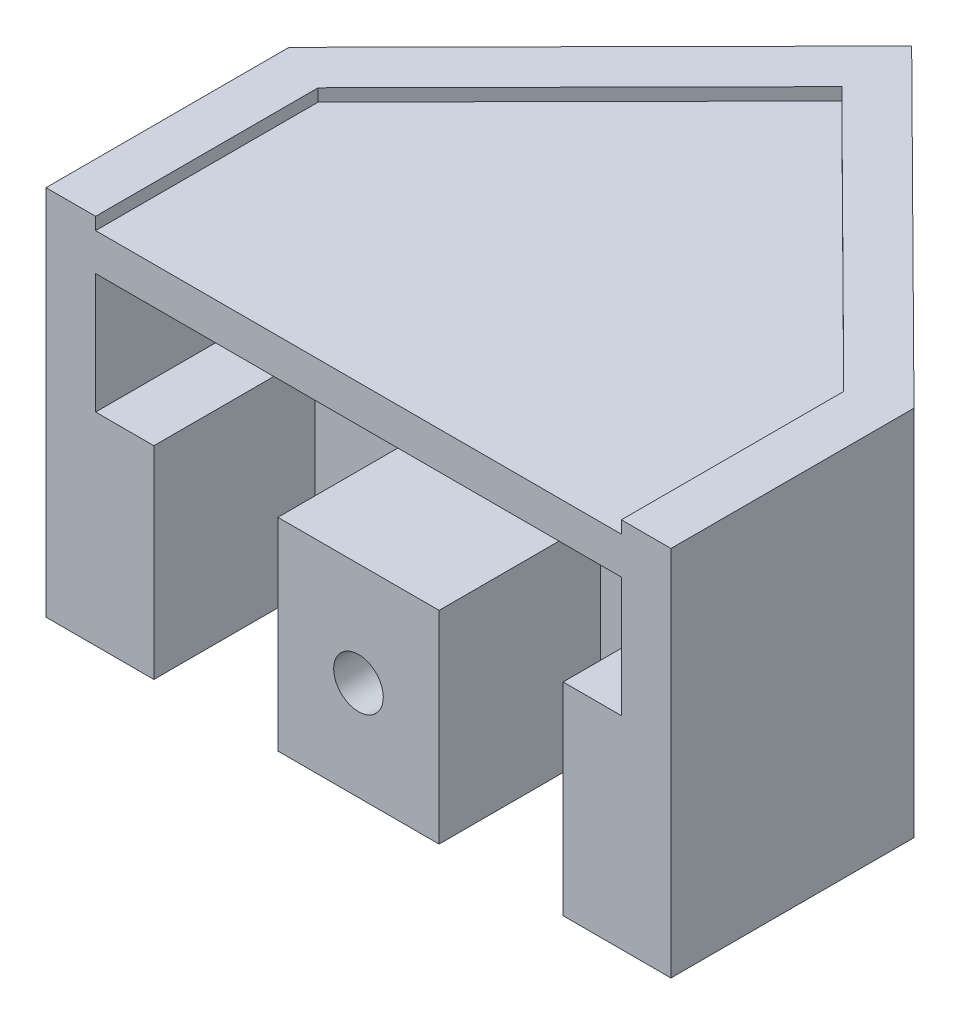
ISO-10303-21;
HEADER;
FILE_DESCRIPTION(('STEP AP214'),'2;1');
FILE_NAME('part.step','',(''),(''),'','','');
FILE_SCHEMA(('AUTOMOTIVE_DESIGN { 1 0 10303 214 1 1 1 1 }'));
ENDSEC;
DATA;
#1=APPLICATION_CONTEXT('core data for automotive mechanical design processes');
#2=APPLICATION_PROTOCOL_DEFINITION('international standard','automotive_design',2000,#1);
#3=PRODUCT_CONTEXT('',#1,'mechanical');
#4=PRODUCT('Part','Part','',(#3));
#5=PRODUCT_RELATED_PRODUCT_CATEGORY('part','',(#4));
#6=PRODUCT_DEFINITION_FORMATION('','',#4);
#7=PRODUCT_DEFINITION_CONTEXT('part definition',#1,'design');
#8=PRODUCT_DEFINITION('design','',#6,#7);
#9=PRODUCT_DEFINITION_SHAPE('','',#8);
#10=(LENGTH_UNIT() NAMED_UNIT(*) SI_UNIT(.MILLI.,.METRE.));
#11=(NAMED_UNIT(*) PLANE_ANGLE_UNIT() SI_UNIT($,.RADIAN.));
#12=(NAMED_UNIT(*) SI_UNIT($,.STERADIAN.) SOLID_ANGLE_UNIT());
#13=UNCERTAINTY_MEASURE_WITH_UNIT(LENGTH_MEASURE(1.E-05),#10,'distance_accuracy_value','');
#14=(GEOMETRIC_REPRESENTATION_CONTEXT(3) GLOBAL_UNCERTAINTY_ASSIGNED_CONTEXT((#13)) GLOBAL_UNIT_ASSIGNED_CONTEXT((#10,
#11,#12)) REPRESENTATION_CONTEXT('',''));
#15=CARTESIAN_POINT('',(0.,0.,0.));
#16=DIRECTION('',(0.,0.,1.));
#17=DIRECTION('',(1.,0.,0.));
#18=AXIS2_PLACEMENT_3D('',#15,#16,#17);
#19=CARTESIAN_POINT('',(0.,0.,2.));
#20=DIRECTION('',(0.,0.,1.));
#21=DIRECTION('',(1.,0.,0.));
#22=AXIS2_PLACEMENT_3D('',#19,#20,#21);
#23=PLANE('',#22);
#24=DIRECTION('',(1.,0.,0.));
#25=VECTOR('',#24,1.);
#26=CARTESIAN_POINT('',(0.,8.16308350215299,2.));
#27=LINE('',#26,#25);
#28=CARTESIAN_POINT('',(-23.2,8.16308350215299,2.));
#29=VERTEX_POINT('',#28);
#30=CARTESIAN_POINT('',(-2.,8.16308350215299,2.));
#31=VERTEX_POINT('',#30);
#32=EDGE_CURVE('E279',#29,#31,#27,.T.);
#33=ORIENTED_EDGE('',*,*,#32,.T.);
#34=DIRECTION('',(0.,1.,0.));
#35=VECTOR('',#34,1.);
#36=CARTESIAN_POINT('',(-2.,0.,2.));
#37=LINE('',#36,#35);
#38=CARTESIAN_POINT('',(-2.,13.,2.));
#39=VERTEX_POINT('',#38);
#40=EDGE_CURVE('E319',#31,#39,#37,.T.);
#41=ORIENTED_EDGE('',*,*,#40,.T.);
#42=DIRECTION('',(1.,0.,0.));
#43=VECTOR('',#42,1.);
#44=CARTESIAN_POINT('',(0.,13.,2.));
#45=LINE('',#44,#43);
#46=CARTESIAN_POINT('',(-23.2,13.,2.));
#47=VERTEX_POINT('',#46);
#48=EDGE_CURVE('E341',#47,#39,#45,.T.);
#49=ORIENTED_EDGE('',*,*,#48,.F.);
#50=DIRECTION('',(0.,1.,0.));
#51=VECTOR('',#50,1.);
#52=CARTESIAN_POINT('',(-23.2,0.,2.));
#53=LINE('',#52,#51);
#54=EDGE_CURVE('E315',#29,#47,#53,.T.);
#55=ORIENTED_EDGE('',*,*,#54,.F.);
#56=EDGE_LOOP('',(#33,#41,#49,#55));
#57=FACE_BOUND('',#56,.T.);
#58=ADVANCED_FACE('F36',(#57),#23,.T.);
#59=CARTESIAN_POINT('',(-9.35,0.,9.8));
#60=DIRECTION('',(-1.,0.,0.));
#61=DIRECTION('',(0.,0.,1.));
#62=AXIS2_PLACEMENT_3D('',#59,#60,#61);
#63=PLANE('',#62);
#64=DIRECTION('',(0.,-1.,0.));
#65=VECTOR('',#64,1.);
#66=CARTESIAN_POINT('',(-9.35,0.,3.3));
#67=LINE('',#66,#65);
#68=CARTESIAN_POINT('',(-9.35,8.16308350215299,3.3));
#69=VERTEX_POINT('',#68);
#70=CARTESIAN_POINT('',(-9.35,0.,3.3));
#71=VERTEX_POINT('',#70);
#72=EDGE_CURVE('E227',#69,#71,#67,.T.);
#73=ORIENTED_EDGE('',*,*,#72,.F.);
#74=DIRECTION('',(0.,0.,-1.));
#75=VECTOR('',#74,1.);
#76=CARTESIAN_POINT('',(-9.35,8.16308350215299,9.8));
#77=LINE('',#76,#75);
#78=CARTESIAN_POINT('',(-9.35,8.16308350215299,9.8));
#79=VERTEX_POINT('',#78);
#80=EDGE_CURVE('E297',#79,#69,#77,.T.);
#81=ORIENTED_EDGE('',*,*,#80,.F.);
#82=DIRECTION('',(0.,1.,0.));
#83=VECTOR('',#82,1.);
#84=CARTESIAN_POINT('',(-9.35,0.,9.8));
#85=LINE('',#84,#83);
#86=CARTESIAN_POINT('',(-9.35,0.,9.8));
#87=VERTEX_POINT('',#86);
#88=EDGE_CURVE('E283',#87,#79,#85,.T.);
#89=ORIENTED_EDGE('',*,*,#88,.F.);
#90=DIRECTION('',(0.,0.,-1.));
#91=VECTOR('',#90,1.);
#92=CARTESIAN_POINT('',(-9.35,0.,9.8));
#93=LINE('',#92,#91);
#94=EDGE_CURVE('E300',#87,#71,#93,.T.);
#95=ORIENTED_EDGE('',*,*,#94,.T.);
#96=EDGE_LOOP('',(#73,#81,#89,#95));
#97=FACE_BOUND('',#96,.T.);
#98=ADVANCED_FACE('F406',(#97),#63,.F.);
#99=CARTESIAN_POINT('',(-4.35,0.,9.8));
#100=DIRECTION('',(-1.,0.,0.));
#101=DIRECTION('',(0.,0.,1.));
#102=AXIS2_PLACEMENT_3D('',#99,#100,#101);
#103=PLANE('',#102);
#104=DIRECTION('',(0.,0.,-1.));
#105=VECTOR('',#104,1.);
#106=CARTESIAN_POINT('',(-4.35,8.16308350215299,9.8));
#107=LINE('',#106,#105);
#108=CARTESIAN_POINT('',(-4.35,8.16308350215299,9.8));
#109=VERTEX_POINT('',#108);
#110=CARTESIAN_POINT('',(-4.35,8.16308350215299,3.3));
#111=VERTEX_POINT('',#110);
#112=EDGE_CURVE('E276',#109,#111,#107,.T.);
#113=ORIENTED_EDGE('',*,*,#112,.T.);
#114=DIRECTION('',(0.,1.,0.));
#115=VECTOR('',#114,1.);
#116=CARTESIAN_POINT('',(-4.35,0.,3.3));
#117=LINE('',#116,#115);
#118=CARTESIAN_POINT('',(-4.35,0.,3.3));
#119=VERTEX_POINT('',#118);
#120=EDGE_CURVE('E235',#119,#111,#117,.T.);
#121=ORIENTED_EDGE('',*,*,#120,.F.);
#122=DIRECTION('',(0.,0.,-1.));
#123=VECTOR('',#122,1.);
#124=CARTESIAN_POINT('',(-4.35,0.,9.8));
#125=LINE('',#124,#123);
#126=CARTESIAN_POINT('',(-4.35,0.,9.8));
#127=VERTEX_POINT('',#126);
#128=EDGE_CURVE('E273',#127,#119,#125,.T.);
#129=ORIENTED_EDGE('',*,*,#128,.F.);
#130=DIRECTION('',(0.,1.,0.));
#131=VECTOR('',#130,1.);
#132=CARTESIAN_POINT('',(-4.35,0.,9.8));
#133=LINE('',#132,#131);
#134=EDGE_CURVE('E267',#127,#109,#133,.T.);
#135=ORIENTED_EDGE('',*,*,#134,.T.);
#136=EDGE_LOOP('',(#113,#121,#129,#135));
#137=FACE_BOUND('',#136,.T.);
#138=ADVANCED_FACE('F412',(#137),#103,.T.);
#139=CARTESIAN_POINT('',(-15.85,0.,9.8));
#140=DIRECTION('',(-1.,0.,0.));
#141=DIRECTION('',(0.,0.,1.));
#142=AXIS2_PLACEMENT_3D('',#139,#140,#141);
#143=PLANE('',#142);
#144=DIRECTION('',(0.,0.,-1.));
#145=VECTOR('',#144,1.);
#146=CARTESIAN_POINT('',(-15.85,8.16308350215299,9.8));
#147=LINE('',#146,#145);
#148=CARTESIAN_POINT('',(-15.85,8.16308350215299,9.8));
#149=VERTEX_POINT('',#148);
#150=CARTESIAN_POINT('',(-15.85,8.16308350215299,3.3));
#151=VERTEX_POINT('',#150);
#152=EDGE_CURVE('E295',#149,#151,#147,.T.);
#153=ORIENTED_EDGE('',*,*,#152,.T.);
#154=DIRECTION('',(0.,1.,0.));
#155=VECTOR('',#154,1.);
#156=CARTESIAN_POINT('',(-15.85,0.,3.3));
#157=LINE('',#156,#155);
#158=CARTESIAN_POINT('',(-15.85,0.,3.3));
#159=VERTEX_POINT('',#158);
#160=EDGE_CURVE('E245',#159,#151,#157,.T.);
#161=ORIENTED_EDGE('',*,*,#160,.F.);
#162=DIRECTION('',(0.,0.,-1.));
#163=VECTOR('',#162,1.);
#164=CARTESIAN_POINT('',(-15.85,0.,9.8));
#165=LINE('',#164,#163);
#166=CARTESIAN_POINT('',(-15.85,0.,9.8));
#167=VERTEX_POINT('',#166);
#168=EDGE_CURVE('E291',#167,#159,#165,.T.);
#169=ORIENTED_EDGE('',*,*,#168,.F.);
#170=DIRECTION('',(0.,1.,0.));
#171=VECTOR('',#170,1.);
#172=CARTESIAN_POINT('',(-15.85,0.,9.8));
#173=LINE('',#172,#171);
#174=EDGE_CURVE('E288',#167,#149,#173,.T.);
#175=ORIENTED_EDGE('',*,*,#174,.T.);
#176=EDGE_LOOP('',(#153,#161,#169,#175));
#177=FACE_BOUND('',#176,.T.);
#178=ADVANCED_FACE('F430',(#177),#143,.T.);
#179=CARTESIAN_POINT('',(-20.85,0.,9.8));
#180=DIRECTION('',(-1.,0.,0.));
#181=DIRECTION('',(0.,0.,1.));
#182=AXIS2_PLACEMENT_3D('',#179,#180,#181);
#183=PLANE('',#182);
#184=DIRECTION('',(0.,-1.,0.));
#185=VECTOR('',#184,1.);
#186=CARTESIAN_POINT('',(-20.85,0.,3.3));
#187=LINE('',#186,#185);
#188=CARTESIAN_POINT('',(-20.85,8.16308350215299,3.3));
#189=VERTEX_POINT('',#188);
#190=CARTESIAN_POINT('',(-20.85,0.,3.3));
#191=VERTEX_POINT('',#190);
#192=EDGE_CURVE('E239',#189,#191,#187,.T.);
#193=ORIENTED_EDGE('',*,*,#192,.F.);
#194=DIRECTION('',(0.,0.,-1.));
#195=VECTOR('',#194,1.);
#196=CARTESIAN_POINT('',(-20.85,8.16308350215299,9.8));
#197=LINE('',#196,#195);
#198=CARTESIAN_POINT('',(-20.85,8.16308350215299,9.8));
#199=VERTEX_POINT('',#198);
#200=EDGE_CURVE('E256',#199,#189,#197,.T.);
#201=ORIENTED_EDGE('',*,*,#200,.F.);
#202=DIRECTION('',(0.,1.,0.));
#203=VECTOR('',#202,1.);
#204=CARTESIAN_POINT('',(-20.85,0.,9.8));
#205=LINE('',#204,#203);
#206=CARTESIAN_POINT('',(-20.85,0.,9.8));
#207=VERTEX_POINT('',#206);
#208=EDGE_CURVE('E254',#207,#199,#205,.T.);
#209=ORIENTED_EDGE('',*,*,#208,.F.);
#210=DIRECTION('',(0.,0.,-1.));
#211=VECTOR('',#210,1.);
#212=CARTESIAN_POINT('',(-20.85,0.,9.8));
#213=LINE('',#212,#211);
#214=EDGE_CURVE('E259',#207,#191,#213,.T.);
#215=ORIENTED_EDGE('',*,*,#214,.T.);
#216=EDGE_LOOP('',(#193,#201,#209,#215));
#217=FACE_BOUND('',#216,.T.);
#218=ADVANCED_FACE('F426',(#217),#183,.F.);
#219=CARTESIAN_POINT('',(0.,0.,2.));
#220=DIRECTION('',(-1.,0.,0.));
#221=DIRECTION('',(0.,0.,1.));
#222=AXIS2_PLACEMENT_3D('',#219,#220,#221);
#223=PLANE('',#222);
#224=DIRECTION('',(0.,1.,0.));
#225=VECTOR('',#224,1.);
#226=CARTESIAN_POINT('',(0.,0.,0.));
#227=LINE('',#226,#225);
#228=CARTESIAN_POINT('',(0.,0.,0.));
#229=VERTEX_POINT('',#228);
#230=CARTESIAN_POINT('',(0.,15.,0.));
#231=VERTEX_POINT('',#230);
#232=EDGE_CURVE('E350',#229,#231,#227,.T.);
#233=ORIENTED_EDGE('',*,*,#232,.T.);
#234=DIRECTION('',(0.,0.,-1.));
#235=VECTOR('',#234,1.);
#236=CARTESIAN_POINT('',(0.,15.,2.));
#237=LINE('',#236,#235);
#238=CARTESIAN_POINT('',(0.,15.,9.8));
#239=VERTEX_POINT('',#238);
#240=EDGE_CURVE('E11',#239,#231,#237,.T.);
#241=ORIENTED_EDGE('',*,*,#240,.F.);
#242=DIRECTION('',(0.,1.,0.));
#243=VECTOR('',#242,1.);
#244=CARTESIAN_POINT('',(0.,0.,9.8));
#245=LINE('',#244,#243);
#246=CARTESIAN_POINT('',(0.,0.,9.8));
#247=VERTEX_POINT('',#246);
#248=EDGE_CURVE('E329',#247,#239,#245,.T.);
#249=ORIENTED_EDGE('',*,*,#248,.F.);
#250=DIRECTION('',(0.,0.,-1.));
#251=VECTOR('',#250,1.);
#252=CARTESIAN_POINT('',(0.,0.,2.));
#253=LINE('',#252,#251);
#254=EDGE_CURVE('E356',#247,#229,#253,.T.);
#255=ORIENTED_EDGE('',*,*,#254,.T.);
#256=EDGE_LOOP('',(#233,#241,#249,#255));
#257=FACE_BOUND('',#256,.T.);
#258=ADVANCED_FACE('F38',(#257),#223,.F.);
#259=CARTESIAN_POINT('',(0.,15.,2.));
#260=DIRECTION('',(0.,-1.,0.));
#261=DIRECTION('',(1.,0.,0.));
#262=AXIS2_PLACEMENT_3D('',#259,#260,#261);
#263=PLANE('',#262);
#264=DIRECTION('',(-0.709721035577049,0.,-0.704482825666773));
#265=VECTOR('',#264,1.);
#266=CARTESIAN_POINT('',(-1.40896565133355,15.,1.4194420711541));
#267=LINE('',#266,#265);
#268=CARTESIAN_POINT('',(-2.,15.,0.832769946273193));
#269=VERTEX_POINT('',#268);
#270=CARTESIAN_POINT('',(-12.6828630783615,15.,-9.77124654808974));
#271=VERTEX_POINT('',#270);
#272=EDGE_CURVE('E206',#269,#271,#267,.T.);
#273=ORIENTED_EDGE('',*,*,#272,.F.);
#274=DIRECTION('',(0.,0.,-1.));
#275=VECTOR('',#274,1.);
#276=CARTESIAN_POINT('',(-2.,15.,0.));
#277=LINE('',#276,#275);
#278=CARTESIAN_POINT('',(-2.,15.,9.8));
#279=VERTEX_POINT('',#278);
#280=EDGE_CURVE('E209',#279,#269,#277,.T.);
#281=ORIENTED_EDGE('',*,*,#280,.F.);
#282=DIRECTION('',(-1.,0.,0.));
#283=VECTOR('',#282,1.);
#284=CARTESIAN_POINT('',(0.,15.,9.8));
#285=LINE('',#284,#283);
#286=EDGE_CURVE('E333',#239,#279,#285,.T.);
#287=ORIENTED_EDGE('',*,*,#286,.F.);
#288=ORIENTED_EDGE('',*,*,#240,.T.);
#289=DIRECTION('',(-0.709721035577049,0.,-0.704482825666773));
#290=VECTOR('',#289,1.);
#291=CARTESIAN_POINT('',(0.,15.,0.));
#292=LINE('',#291,#290);
#293=CARTESIAN_POINT('',(-12.6933394981821,15.,-12.5996542705774));
#294=VERTEX_POINT('',#293);
#295=EDGE_CURVE('E303',#231,#294,#292,.T.);
#296=ORIENTED_EDGE('',*,*,#295,.T.);
#297=DIRECTION('',(-0.704482825666773,0.,0.709721035577049));
#298=VECTOR('',#297,1.);
#299=CARTESIAN_POINT('',(-12.6933394981821,15.,-12.5996542705774));
#300=LINE('',#299,#298);
#301=CARTESIAN_POINT('',(-25.2,15.,0.));
#302=VERTEX_POINT('',#301);
#303=EDGE_CURVE('E308',#294,#302,#300,.T.);
#304=ORIENTED_EDGE('',*,*,#303,.T.);
#305=DIRECTION('',(0.,0.,-1.));
#306=VECTOR('',#305,1.);
#307=CARTESIAN_POINT('',(-25.2,15.,2.));
#308=LINE('',#307,#306);
#309=CARTESIAN_POINT('',(-25.2,15.,9.8));
#310=VERTEX_POINT('',#309);
#311=EDGE_CURVE('E44',#310,#302,#308,.T.);
#312=ORIENTED_EDGE('',*,*,#311,.F.);
#313=CARTESIAN_POINT('',(-23.2,15.,9.8));
#314=VERTEX_POINT('',#313);
#315=EDGE_CURVE('E332',#314,#310,#285,.T.);
#316=ORIENTED_EDGE('',*,*,#315,.F.);
#317=DIRECTION('',(0.,0.,1.));
#318=VECTOR('',#317,1.);
#319=CARTESIAN_POINT('',(-23.2,15.,0.));
#320=LINE('',#319,#318);
#321=CARTESIAN_POINT('',(-23.2,15.,0.824090961048511));
#322=VERTEX_POINT('',#321);
#323=EDGE_CURVE('E220',#322,#314,#320,.T.);
#324=ORIENTED_EDGE('',*,*,#323,.F.);
#325=DIRECTION('',(-0.704482825666773,0.,0.709721035577049));
#326=VECTOR('',#325,1.);
#327=CARTESIAN_POINT('',(-11.273897427028,15.,-11.1906886192438));
#328=LINE('',#327,#326);
#329=EDGE_CURVE('E192',#271,#322,#328,.T.);
#330=ORIENTED_EDGE('',*,*,#329,.F.);
#331=EDGE_LOOP('',(#273,#281,#287,#288,#296,#304,#312,#316,#324,#330));
#332=FACE_BOUND('',#331,.T.);
#333=ADVANCED_FACE('F370',(#332),#263,.F.);
#334=CARTESIAN_POINT('',(-25.2,0.,2.));
#335=DIRECTION('',(1.,0.,0.));
#336=DIRECTION('',(0.,0.,-1.));
#337=AXIS2_PLACEMENT_3D('',#334,#335,#336);
#338=PLANE('',#337);
#339=DIRECTION('',(0.,-1.,0.));
#340=VECTOR('',#339,1.);
#341=CARTESIAN_POINT('',(-25.2,0.,0.));
#342=LINE('',#341,#340);
#343=CARTESIAN_POINT('',(-25.2,0.,0.));
#344=VERTEX_POINT('',#343);
#345=EDGE_CURVE('E353',#302,#344,#342,.T.);
#346=ORIENTED_EDGE('',*,*,#345,.T.);
#347=DIRECTION('',(0.,0.,-1.));
#348=VECTOR('',#347,1.);
#349=CARTESIAN_POINT('',(-25.2,0.,2.));
#350=LINE('',#349,#348);
#351=CARTESIAN_POINT('',(-25.2,0.,9.8));
#352=VERTEX_POINT('',#351);
#353=EDGE_CURVE('E359',#352,#344,#350,.T.);
#354=ORIENTED_EDGE('',*,*,#353,.F.);
#355=DIRECTION('',(0.,-1.,0.));
#356=VECTOR('',#355,1.);
#357=CARTESIAN_POINT('',(-25.2,0.,9.8));
#358=LINE('',#357,#356);
#359=EDGE_CURVE('E336',#310,#352,#358,.T.);
#360=ORIENTED_EDGE('',*,*,#359,.F.);
#361=ORIENTED_EDGE('',*,*,#311,.T.);
#362=EDGE_LOOP('',(#346,#354,#360,#361));
#363=FACE_BOUND('',#362,.T.);
#364=ADVANCED_FACE('F365',(#363),#338,.F.);
#365=CARTESIAN_POINT('',(0.,0.,2.));
#366=DIRECTION('',(0.,1.,0.));
#367=DIRECTION('',(-1.,0.,0.));
#368=AXIS2_PLACEMENT_3D('',#365,#366,#367);
#369=PLANE('',#368);
#370=ORIENTED_EDGE('',*,*,#168,.T.);
#371=DIRECTION('',(1.,0.,0.));
#372=VECTOR('',#371,1.);
#373=CARTESIAN_POINT('',(-20.85,0.,3.3));
#374=LINE('',#373,#372);
#375=EDGE_CURVE('E242',#191,#159,#374,.T.);
#376=ORIENTED_EDGE('',*,*,#375,.F.);
#377=ORIENTED_EDGE('',*,*,#214,.F.);
#378=DIRECTION('',(1.,0.,0.));
#379=VECTOR('',#378,1.);
#380=CARTESIAN_POINT('',(0.,0.,9.8));
#381=LINE('',#380,#379);
#382=EDGE_CURVE('E316',#352,#207,#381,.T.);
#383=ORIENTED_EDGE('',*,*,#382,.F.);
#384=ORIENTED_EDGE('',*,*,#353,.T.);
#385=DIRECTION('',(-0.704482825666773,0.,0.709721035577049));
#386=VECTOR('',#385,1.);
#387=CARTESIAN_POINT('',(-12.6933394981821,0.,-12.5996542705774));
#388=LINE('',#387,#386);
#389=CARTESIAN_POINT('',(-12.6933394981821,0.,-12.5996542705774));
#390=VERTEX_POINT('',#389);
#391=EDGE_CURVE('E307',#390,#344,#388,.T.);
#392=ORIENTED_EDGE('',*,*,#391,.F.);
#393=DIRECTION('',(-0.709721035577049,0.,-0.704482825666773));
#394=VECTOR('',#393,1.);
#395=CARTESIAN_POINT('',(0.,0.,0.));
#396=LINE('',#395,#394);
#397=EDGE_CURVE('E304',#229,#390,#396,.T.);
#398=ORIENTED_EDGE('',*,*,#397,.F.);
#399=ORIENTED_EDGE('',*,*,#254,.F.);
#400=DIRECTION('',(1.,0.,0.));
#401=VECTOR('',#400,1.);
#402=CARTESIAN_POINT('',(0.,0.,9.8));
#403=LINE('',#402,#401);
#404=EDGE_CURVE('E326',#127,#247,#403,.T.);
#405=ORIENTED_EDGE('',*,*,#404,.F.);
#406=ORIENTED_EDGE('',*,*,#128,.T.);
#407=DIRECTION('',(1.,0.,0.));
#408=VECTOR('',#407,1.);
#409=CARTESIAN_POINT('',(-9.35,0.,3.3));
#410=LINE('',#409,#408);
#411=EDGE_CURVE('E59',#71,#119,#410,.T.);
#412=ORIENTED_EDGE('',*,*,#411,.F.);
#413=ORIENTED_EDGE('',*,*,#94,.F.);
#414=DIRECTION('',(1.,0.,0.));
#415=VECTOR('',#414,1.);
#416=CARTESIAN_POINT('',(0.,0.,9.8));
#417=LINE('',#416,#415);
#418=EDGE_CURVE('E280',#167,#87,#417,.T.);
#419=ORIENTED_EDGE('',*,*,#418,.F.);
#420=EDGE_LOOP('',(#370,#376,#377,#383,#384,#392,#398,#399,#405,#406,#412,#413,#419));
#421=FACE_BOUND('',#420,.T.);
#422=ADVANCED_FACE('F377',(#421),#369,.F.);
#423=CARTESIAN_POINT('',(-23.2,0.,9.8));
#424=DIRECTION('',(-1.,0.,0.));
#425=DIRECTION('',(0.,0.,1.));
#426=AXIS2_PLACEMENT_3D('',#423,#424,#425);
#427=PLANE('',#426);
#428=DIRECTION('',(0.,1.,0.));
#429=VECTOR('',#428,1.);
#430=CARTESIAN_POINT('',(-23.2,0.,9.8));
#431=LINE('',#430,#429);
#432=CARTESIAN_POINT('',(-23.2,8.16308350215299,9.8));
#433=VERTEX_POINT('',#432);
#434=CARTESIAN_POINT('',(-23.2,13.,9.8));
#435=VERTEX_POINT('',#434);
#436=EDGE_CURVE('E318',#433,#435,#431,.T.);
#437=ORIENTED_EDGE('',*,*,#436,.F.);
#438=DIRECTION('',(0.,0.,-1.));
#439=VECTOR('',#438,1.);
#440=CARTESIAN_POINT('',(-23.2,8.16308350215299,9.8));
#441=LINE('',#440,#439);
#442=EDGE_CURVE('E261',#433,#29,#441,.T.);
#443=ORIENTED_EDGE('',*,*,#442,.T.);
#444=ORIENTED_EDGE('',*,*,#54,.T.);
#445=DIRECTION('',(0.,0.,-1.));
#446=VECTOR('',#445,1.);
#447=CARTESIAN_POINT('',(-23.2,13.,9.8));
#448=LINE('',#447,#446);
#449=EDGE_CURVE('E347',#435,#47,#448,.T.);
#450=ORIENTED_EDGE('',*,*,#449,.F.);
#451=EDGE_LOOP('',(#437,#443,#444,#450));
#452=FACE_BOUND('',#451,.T.);
#453=ADVANCED_FACE('F417',(#452),#427,.F.);
#454=CARTESIAN_POINT('',(0.,13.,9.8));
#455=DIRECTION('',(0.,1.,0.));
#456=DIRECTION('',(0.,0.,1.));
#457=AXIS2_PLACEMENT_3D('',#454,#455,#456);
#458=PLANE('',#457);
#459=ORIENTED_EDGE('',*,*,#48,.T.);
#460=DIRECTION('',(0.,0.,-1.));
#461=VECTOR('',#460,1.);
#462=CARTESIAN_POINT('',(-2.,13.,9.8));
#463=LINE('',#462,#461);
#464=CARTESIAN_POINT('',(-2.,13.,9.8));
#465=VERTEX_POINT('',#464);
#466=EDGE_CURVE('E339',#465,#39,#463,.T.);
#467=ORIENTED_EDGE('',*,*,#466,.F.);
#468=DIRECTION('',(1.,0.,0.));
#469=VECTOR('',#468,1.);
#470=CARTESIAN_POINT('',(0.,13.,9.8));
#471=LINE('',#470,#469);
#472=EDGE_CURVE('E321',#435,#465,#471,.T.);
#473=ORIENTED_EDGE('',*,*,#472,.F.);
#474=ORIENTED_EDGE('',*,*,#449,.T.);
#475=EDGE_LOOP('',(#459,#467,#473,#474));
#476=FACE_BOUND('',#475,.T.);
#477=ADVANCED_FACE('F475',(#476),#458,.F.);
#478=CARTESIAN_POINT('',(-2.,0.,9.8));
#479=DIRECTION('',(-1.,0.,0.));
#480=DIRECTION('',(0.,0.,1.));
#481=AXIS2_PLACEMENT_3D('',#478,#479,#480);
#482=PLANE('',#481);
#483=DIRECTION('',(0.,0.,-1.));
#484=VECTOR('',#483,1.);
#485=CARTESIAN_POINT('',(-2.,8.16308350215299,9.8));
#486=LINE('',#485,#484);
#487=CARTESIAN_POINT('',(-2.,8.16308350215299,9.8));
#488=VERTEX_POINT('',#487);
#489=EDGE_CURVE('E270',#488,#31,#486,.T.);
#490=ORIENTED_EDGE('',*,*,#489,.F.);
#491=DIRECTION('',(0.,1.,0.));
#492=VECTOR('',#491,1.);
#493=CARTESIAN_POINT('',(-2.,0.,9.8));
#494=LINE('',#493,#492);
#495=EDGE_CURVE('E324',#488,#465,#494,.T.);
#496=ORIENTED_EDGE('',*,*,#495,.T.);
#497=ORIENTED_EDGE('',*,*,#466,.T.);
#498=ORIENTED_EDGE('',*,*,#40,.F.);
#499=EDGE_LOOP('',(#490,#496,#497,#498));
#500=FACE_BOUND('',#499,.T.);
#501=ADVANCED_FACE('F479',(#500),#482,.T.);
#502=CARTESIAN_POINT('',(0.,0.,9.8));
#503=DIRECTION('',(0.,0.,1.));
#504=DIRECTION('',(1.,0.,0.));
#505=AXIS2_PLACEMENT_3D('',#502,#503,#504);
#506=PLANE('',#505);
#507=DIRECTION('',(0.,1.,0.));
#508=VECTOR('',#507,1.);
#509=CARTESIAN_POINT('',(-2.,14.5,9.8));
#510=LINE('',#509,#508);
#511=CARTESIAN_POINT('',(-2.,14.5,9.8));
#512=VERTEX_POINT('',#511);
#513=EDGE_CURVE('E230',#512,#279,#510,.T.);
#514=ORIENTED_EDGE('',*,*,#513,.F.);
#515=DIRECTION('',(1.,0.,0.));
#516=VECTOR('',#515,1.);
#517=CARTESIAN_POINT('',(0.,14.5,9.8));
#518=LINE('',#517,#516);
#519=CARTESIAN_POINT('',(-23.2,14.5,9.8));
#520=VERTEX_POINT('',#519);
#521=EDGE_CURVE('E201',#520,#512,#518,.T.);
#522=ORIENTED_EDGE('',*,*,#521,.F.);
#523=DIRECTION('',(0.,1.,0.));
#524=VECTOR('',#523,1.);
#525=CARTESIAN_POINT('',(-23.2,14.5,9.8));
#526=LINE('',#525,#524);
#527=EDGE_CURVE('E195',#520,#314,#526,.T.);
#528=ORIENTED_EDGE('',*,*,#527,.T.);
#529=ORIENTED_EDGE('',*,*,#315,.T.);
#530=ORIENTED_EDGE('',*,*,#359,.T.);
#531=ORIENTED_EDGE('',*,*,#382,.T.);
#532=ORIENTED_EDGE('',*,*,#208,.T.);
#533=DIRECTION('',(1.,0.,0.));
#534=VECTOR('',#533,1.);
#535=CARTESIAN_POINT('',(0.,8.16308350215299,9.8));
#536=LINE('',#535,#534);
#537=EDGE_CURVE('E251',#433,#199,#536,.T.);
#538=ORIENTED_EDGE('',*,*,#537,.F.);
#539=ORIENTED_EDGE('',*,*,#436,.T.);
#540=ORIENTED_EDGE('',*,*,#472,.T.);
#541=ORIENTED_EDGE('',*,*,#495,.F.);
#542=DIRECTION('',(1.,0.,0.));
#543=VECTOR('',#542,1.);
#544=CARTESIAN_POINT('',(0.,8.16308350215299,9.8));
#545=LINE('',#544,#543);
#546=EDGE_CURVE('E264',#109,#488,#545,.T.);
#547=ORIENTED_EDGE('',*,*,#546,.F.);
#548=ORIENTED_EDGE('',*,*,#134,.F.);
#549=ORIENTED_EDGE('',*,*,#404,.T.);
#550=ORIENTED_EDGE('',*,*,#248,.T.);
#551=ORIENTED_EDGE('',*,*,#286,.T.);
#552=EDGE_LOOP('',(#514,#522,#528,#529,#530,#531,#532,#538,#539,#540,#541,#547,#548,#549,#550,#551));
#553=FACE_BOUND('',#552,.T.);
#554=ADVANCED_FACE('F382',(#553),#506,.T.);
#555=CARTESIAN_POINT('',(-12.6933394981821,0.,-12.5996542705774));
#556=DIRECTION('',(-0.709721035577049,0.,-0.704482825666773));
#557=DIRECTION('',(-0.704482825666773,0.,0.709721035577049));
#558=AXIS2_PLACEMENT_3D('',#555,#556,#557);
#559=PLANE('',#558);
#560=ORIENTED_EDGE('',*,*,#303,.F.);
#561=DIRECTION('',(0.,1.,0.));
#562=VECTOR('',#561,1.);
#563=CARTESIAN_POINT('',(-12.6933394981821,0.,-12.5996542705774));
#564=LINE('',#563,#562);
#565=EDGE_CURVE('E310',#390,#294,#564,.T.);
#566=ORIENTED_EDGE('',*,*,#565,.F.);
#567=ORIENTED_EDGE('',*,*,#391,.T.);
#568=ORIENTED_EDGE('',*,*,#345,.F.);
#569=EDGE_LOOP('',(#560,#566,#567,#568));
#570=FACE_BOUND('',#569,.T.);
#571=ADVANCED_FACE('F373',(#570),#559,.T.);
#572=CARTESIAN_POINT('',(0.,0.,0.));
#573=DIRECTION('',(0.704482825666773,0.,-0.709721035577049));
#574=DIRECTION('',(-0.709721035577049,0.,-0.704482825666773));
#575=AXIS2_PLACEMENT_3D('',#572,#573,#574);
#576=PLANE('',#575);
#577=ORIENTED_EDGE('',*,*,#295,.F.);
#578=ORIENTED_EDGE('',*,*,#232,.F.);
#579=ORIENTED_EDGE('',*,*,#397,.T.);
#580=ORIENTED_EDGE('',*,*,#565,.T.);
#581=EDGE_LOOP('',(#577,#578,#579,#580));
#582=FACE_BOUND('',#581,.T.);
#583=ADVANCED_FACE('F392',(#582),#576,.T.);
#584=CARTESIAN_POINT('',(0.,8.16308350215299,9.8));
#585=DIRECTION('',(0.,1.,0.));
#586=DIRECTION('',(0.,0.,1.));
#587=AXIS2_PLACEMENT_3D('',#584,#585,#586);
#588=PLANE('',#587);
#589=ORIENTED_EDGE('',*,*,#32,.F.);
#590=ORIENTED_EDGE('',*,*,#442,.F.);
#591=ORIENTED_EDGE('',*,*,#537,.T.);
#592=ORIENTED_EDGE('',*,*,#200,.T.);
#593=DIRECTION('',(-1.,0.,0.));
#594=VECTOR('',#593,1.);
#595=CARTESIAN_POINT('',(-20.85,8.16308350215299,3.3));
#596=LINE('',#595,#594);
#597=EDGE_CURVE('E248',#151,#189,#596,.T.);
#598=ORIENTED_EDGE('',*,*,#597,.F.);
#599=ORIENTED_EDGE('',*,*,#152,.F.);
#600=DIRECTION('',(1.,0.,0.));
#601=VECTOR('',#600,1.);
#602=CARTESIAN_POINT('',(0.,8.16308350215299,9.8));
#603=LINE('',#602,#601);
#604=EDGE_CURVE('E285',#149,#79,#603,.T.);
#605=ORIENTED_EDGE('',*,*,#604,.T.);
#606=ORIENTED_EDGE('',*,*,#80,.T.);
#607=DIRECTION('',(-1.,0.,0.));
#608=VECTOR('',#607,1.);
#609=CARTESIAN_POINT('',(-9.35,8.16308350215299,3.3));
#610=LINE('',#609,#608);
#611=EDGE_CURVE('E237',#111,#69,#610,.T.);
#612=ORIENTED_EDGE('',*,*,#611,.F.);
#613=ORIENTED_EDGE('',*,*,#112,.F.);
#614=ORIENTED_EDGE('',*,*,#546,.T.);
#615=ORIENTED_EDGE('',*,*,#489,.T.);
#616=EDGE_LOOP('',(#589,#590,#591,#592,#598,#599,#605,#606,#612,#613,#614,#615));
#617=FACE_BOUND('',#616,.T.);
#618=ADVANCED_FACE('F394',(#617),#588,.T.);
#619=CARTESIAN_POINT('',(0.,0.,9.8));
#620=DIRECTION('',(0.,0.,1.));
#621=DIRECTION('',(1.,0.,0.));
#622=AXIS2_PLACEMENT_3D('',#619,#620,#621);
#623=PLANE('',#622);
#624=CARTESIAN_POINT('',(-12.6,4.,9.8));
#625=DIRECTION('',(0.,0.,1.));
#626=DIRECTION('',(1.,0.,0.));
#627=AXIS2_PLACEMENT_3D('',#624,#625,#626);
#628=CIRCLE('',#627,1.);
#629=CARTESIAN_POINT('',(-11.6,4.,9.8));
#630=VERTEX_POINT('',#629);
#631=EDGE_CURVE('E212',#630,#630,#628,.T.);
#632=ORIENTED_EDGE('',*,*,#631,.F.);
#633=EDGE_LOOP('',(#632));
#634=FACE_BOUND('',#633,.T.);
#635=ORIENTED_EDGE('',*,*,#418,.T.);
#636=ORIENTED_EDGE('',*,*,#88,.T.);
#637=ORIENTED_EDGE('',*,*,#604,.F.);
#638=ORIENTED_EDGE('',*,*,#174,.F.);
#639=EDGE_LOOP('',(#635,#636,#637,#638));
#640=FACE_BOUND('',#639,.T.);
#641=ADVANCED_FACE('F400',(#634,#640),#623,.T.);
#642=CARTESIAN_POINT('',(0.,0.,3.3));
#643=DIRECTION('',(0.,0.,-1.));
#644=DIRECTION('',(-1.,0.,0.));
#645=AXIS2_PLACEMENT_3D('',#642,#643,#644);
#646=PLANE('',#645);
#647=ORIENTED_EDGE('',*,*,#192,.T.);
#648=ORIENTED_EDGE('',*,*,#375,.T.);
#649=ORIENTED_EDGE('',*,*,#160,.T.);
#650=ORIENTED_EDGE('',*,*,#597,.T.);
#651=EDGE_LOOP('',(#647,#648,#649,#650));
#652=FACE_BOUND('',#651,.T.);
#653=ADVANCED_FACE('F440',(#652),#646,.F.);
#654=CARTESIAN_POINT('',(0.,0.,3.3));
#655=DIRECTION('',(0.,0.,-1.));
#656=DIRECTION('',(-1.,0.,0.));
#657=AXIS2_PLACEMENT_3D('',#654,#655,#656);
#658=PLANE('',#657);
#659=ORIENTED_EDGE('',*,*,#72,.T.);
#660=ORIENTED_EDGE('',*,*,#411,.T.);
#661=ORIENTED_EDGE('',*,*,#120,.T.);
#662=ORIENTED_EDGE('',*,*,#611,.T.);
#663=EDGE_LOOP('',(#659,#660,#661,#662));
#664=FACE_BOUND('',#663,.T.);
#665=ADVANCED_FACE('F450',(#664),#658,.F.);
#666=CARTESIAN_POINT('',(-11.273897427028,14.5,-11.1906886192438));
#667=DIRECTION('',(-0.709721035577049,0.,-0.704482825666773));
#668=DIRECTION('',(-0.704482825666773,0.,0.709721035577049));
#669=AXIS2_PLACEMENT_3D('',#666,#667,#668);
#670=PLANE('',#669);
#671=ORIENTED_EDGE('',*,*,#329,.T.);
#672=DIRECTION('',(0.,1.,0.));
#673=VECTOR('',#672,1.);
#674=CARTESIAN_POINT('',(-23.2,14.5,0.824090961048511));
#675=LINE('',#674,#673);
#676=CARTESIAN_POINT('',(-23.2,14.5,0.824090961048511));
#677=VERTEX_POINT('',#676);
#678=EDGE_CURVE('E187',#677,#322,#675,.T.);
#679=ORIENTED_EDGE('',*,*,#678,.F.);
#680=DIRECTION('',(-0.704482825666773,0.,0.709721035577049));
#681=VECTOR('',#680,1.);
#682=CARTESIAN_POINT('',(-11.273897427028,14.5,-11.1906886192438));
#683=LINE('',#682,#681);
#684=CARTESIAN_POINT('',(-12.6828630783615,14.5,-9.77124654808974));
#685=VERTEX_POINT('',#684);
#686=EDGE_CURVE('E189',#685,#677,#683,.T.);
#687=ORIENTED_EDGE('',*,*,#686,.F.);
#688=DIRECTION('',(0.,1.,0.));
#689=VECTOR('',#688,1.);
#690=CARTESIAN_POINT('',(-12.6828630783615,14.5,-9.77124654808974));
#691=LINE('',#690,#689);
#692=EDGE_CURVE('E225',#685,#271,#691,.T.);
#693=ORIENTED_EDGE('',*,*,#692,.T.);
#694=EDGE_LOOP('',(#671,#679,#687,#693));
#695=FACE_BOUND('',#694,.T.);
#696=ADVANCED_FACE('F188',(#695),#670,.F.);
#697=CARTESIAN_POINT('',(-1.40896565133355,14.5,1.4194420711541));
#698=DIRECTION('',(0.704482825666773,0.,-0.709721035577049));
#699=DIRECTION('',(-0.709721035577049,0.,-0.704482825666773));
#700=AXIS2_PLACEMENT_3D('',#697,#698,#699);
#701=PLANE('',#700);
#702=ORIENTED_EDGE('',*,*,#272,.T.);
#703=ORIENTED_EDGE('',*,*,#692,.F.);
#704=DIRECTION('',(-0.709721035577049,0.,-0.704482825666773));
#705=VECTOR('',#704,1.);
#706=CARTESIAN_POINT('',(-1.40896565133355,14.5,1.4194420711541));
#707=LINE('',#706,#705);
#708=CARTESIAN_POINT('',(-2.,14.5,0.832769946273193));
#709=VERTEX_POINT('',#708);
#710=EDGE_CURVE('E196',#709,#685,#707,.T.);
#711=ORIENTED_EDGE('',*,*,#710,.F.);
#712=DIRECTION('',(0.,1.,0.));
#713=VECTOR('',#712,1.);
#714=CARTESIAN_POINT('',(-2.,14.5,0.832769946273193));
#715=LINE('',#714,#713);
#716=EDGE_CURVE('E228',#709,#269,#715,.T.);
#717=ORIENTED_EDGE('',*,*,#716,.T.);
#718=EDGE_LOOP('',(#702,#703,#711,#717));
#719=FACE_BOUND('',#718,.T.);
#720=ADVANCED_FACE('F385',(#719),#701,.F.);
#721=CARTESIAN_POINT('',(-2.,14.5,0.));
#722=DIRECTION('',(1.,0.,0.));
#723=DIRECTION('',(0.,0.,-1.));
#724=AXIS2_PLACEMENT_3D('',#721,#722,#723);
#725=PLANE('',#724);
#726=ORIENTED_EDGE('',*,*,#280,.T.);
#727=ORIENTED_EDGE('',*,*,#716,.F.);
#728=DIRECTION('',(0.,0.,-1.));
#729=VECTOR('',#728,1.);
#730=CARTESIAN_POINT('',(-2.,14.5,0.));
#731=LINE('',#730,#729);
#732=EDGE_CURVE('E216',#512,#709,#731,.T.);
#733=ORIENTED_EDGE('',*,*,#732,.F.);
#734=ORIENTED_EDGE('',*,*,#513,.T.);
#735=EDGE_LOOP('',(#726,#727,#733,#734));
#736=FACE_BOUND('',#735,.T.);
#737=ADVANCED_FACE('F490',(#736),#725,.F.);
#738=CARTESIAN_POINT('',(-23.2,14.5,0.));
#739=DIRECTION('',(-1.,0.,0.));
#740=DIRECTION('',(0.,-1.,0.));
#741=AXIS2_PLACEMENT_3D('',#738,#739,#740);
#742=PLANE('',#741);
#743=ORIENTED_EDGE('',*,*,#323,.T.);
#744=ORIENTED_EDGE('',*,*,#527,.F.);
#745=DIRECTION('',(0.,0.,1.));
#746=VECTOR('',#745,1.);
#747=CARTESIAN_POINT('',(-23.2,14.5,0.));
#748=LINE('',#747,#746);
#749=EDGE_CURVE('E51',#677,#520,#748,.T.);
#750=ORIENTED_EDGE('',*,*,#749,.F.);
#751=ORIENTED_EDGE('',*,*,#678,.T.);
#752=EDGE_LOOP('',(#743,#744,#750,#751));
#753=FACE_BOUND('',#752,.T.);
#754=ADVANCED_FACE('F198',(#753),#742,.F.);
#755=CARTESIAN_POINT('',(0.,14.5,0.));
#756=DIRECTION('',(0.,1.,0.));
#757=DIRECTION('',(-1.,0.,0.));
#758=AXIS2_PLACEMENT_3D('',#755,#756,#757);
#759=PLANE('',#758);
#760=ORIENTED_EDGE('',*,*,#686,.T.);
#761=ORIENTED_EDGE('',*,*,#749,.T.);
#762=ORIENTED_EDGE('',*,*,#521,.T.);
#763=ORIENTED_EDGE('',*,*,#732,.T.);
#764=ORIENTED_EDGE('',*,*,#710,.T.);
#765=EDGE_LOOP('',(#760,#761,#762,#763,#764));
#766=FACE_BOUND('',#765,.T.);
#767=ADVANCED_FACE('F203',(#766),#759,.T.);
#768=CARTESIAN_POINT('',(-12.6,4.,3.8));
#769=DIRECTION('',(0.,0.,1.));
#770=DIRECTION('',(1.,0.,0.));
#771=AXIS2_PLACEMENT_3D('',#768,#769,#770);
#772=CYLINDRICAL_SURFACE('',#771,1.);
#773=CARTESIAN_POINT('',(-12.6,4.,3.8));
#774=DIRECTION('',(0.,0.,1.));
#775=DIRECTION('',(1.,0.,0.));
#776=AXIS2_PLACEMENT_3D('',#773,#774,#775);
#777=CIRCLE('',#776,1.);
#778=CARTESIAN_POINT('',(-11.6,4.,3.8));
#779=VERTEX_POINT('',#778);
#780=EDGE_CURVE('E221',#779,#779,#777,.T.);
#781=ORIENTED_EDGE('',*,*,#780,.F.);
#782=EDGE_LOOP('',(#781));
#783=FACE_BOUND('',#782,.T.);
#784=ORIENTED_EDGE('',*,*,#631,.T.);
#785=EDGE_LOOP('',(#784));
#786=FACE_BOUND('',#785,.T.);
#787=ADVANCED_FACE('F497',(#783,#786),#772,.F.);
#788=CARTESIAN_POINT('',(-12.6,4.,3.8));
#789=DIRECTION('',(0.,0.,1.));
#790=DIRECTION('',(1.,0.,0.));
#791=AXIS2_PLACEMENT_3D('',#788,#789,#790);
#792=PLANE('',#791);
#793=ORIENTED_EDGE('',*,*,#780,.T.);
#794=EDGE_LOOP('',(#793));
#795=FACE_BOUND('',#794,.T.);
#796=ADVANCED_FACE('F500',(#795),#792,.T.);
#797=CLOSED_SHELL('',(#58,#98,#138,#178,#218,#258,#333,#364,#422,#453,#477,#501,#554,#571,#583,
#618,#641,#653,#665,#696,#720,#737,#754,#767,#787,#796));
#798=MANIFOLD_SOLID_BREP('B2',#797);
#799=ADVANCED_BREP_SHAPE_REPRESENTATION('',(#18,#798),#14);
#800=SHAPE_DEFINITION_REPRESENTATION(#9,#799);
ENDSEC;
END-ISO-10303-21;
